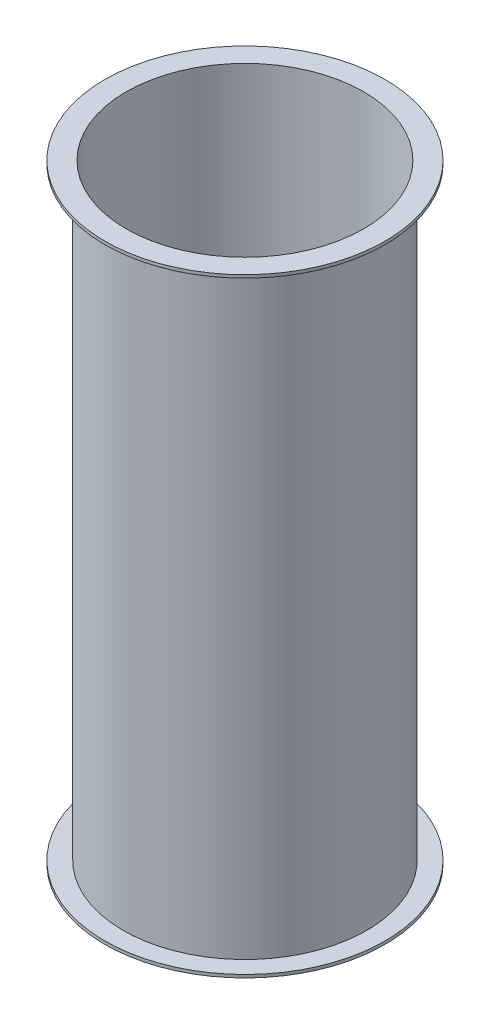
ISO-10303-21;
HEADER;
FILE_DESCRIPTION(('STEP AP214'),'2;1');
FILE_NAME('part.step','',(''),(''),'','','');
FILE_SCHEMA(('AUTOMOTIVE_DESIGN { 1 0 10303 214 1 1 1 1 }'));
ENDSEC;
DATA;
#1=APPLICATION_CONTEXT('core data for automotive mechanical design processes');
#2=APPLICATION_PROTOCOL_DEFINITION('international standard','automotive_design',2000,#1);
#3=PRODUCT_CONTEXT('',#1,'mechanical');
#4=PRODUCT('Part','Part','',(#3));
#5=PRODUCT_RELATED_PRODUCT_CATEGORY('part','',(#4));
#6=PRODUCT_DEFINITION_FORMATION('','',#4);
#7=PRODUCT_DEFINITION_CONTEXT('part definition',#1,'design');
#8=PRODUCT_DEFINITION('design','',#6,#7);
#9=PRODUCT_DEFINITION_SHAPE('','',#8);
#10=(LENGTH_UNIT() NAMED_UNIT(*) SI_UNIT(.MILLI.,.METRE.));
#11=(NAMED_UNIT(*) PLANE_ANGLE_UNIT() SI_UNIT($,.RADIAN.));
#12=(NAMED_UNIT(*) SI_UNIT($,.STERADIAN.) SOLID_ANGLE_UNIT());
#13=UNCERTAINTY_MEASURE_WITH_UNIT(LENGTH_MEASURE(1.E-05),#10,'distance_accuracy_value','');
#14=(GEOMETRIC_REPRESENTATION_CONTEXT(3) GLOBAL_UNCERTAINTY_ASSIGNED_CONTEXT((#13)) GLOBAL_UNIT_ASSIGNED_CONTEXT((#10,
#11,#12)) REPRESENTATION_CONTEXT('',''));
#15=CARTESIAN_POINT('',(0.,0.,0.));
#16=DIRECTION('',(0.,0.,1.));
#17=DIRECTION('',(1.,0.,0.));
#18=AXIS2_PLACEMENT_3D('',#15,#16,#17);
#19=CARTESIAN_POINT('',(-42.5,200.,0.));
#20=DIRECTION('',(0.,1.,0.));
#21=DIRECTION('',(1.,0.,0.));
#22=AXIS2_PLACEMENT_3D('',#19,#20,#21);
#23=PLANE('',#22);
#24=CARTESIAN_POINT('',(0.,200.,0.));
#25=DIRECTION('',(0.,1.,0.));
#26=DIRECTION('',(-1.,0.,0.));
#27=AXIS2_PLACEMENT_3D('',#24,#25,#26);
#28=CIRCLE('',#27,39.);
#29=CARTESIAN_POINT('',(-39.,200.,0.));
#30=VERTEX_POINT('',#29);
#31=EDGE_CURVE('E61',#30,#30,#28,.T.);
#32=ORIENTED_EDGE('',*,*,#31,.F.);
#33=EDGE_LOOP('',(#32));
#34=FACE_BOUND('',#33,.T.);
#35=CARTESIAN_POINT('',(0.,200.,0.));
#36=DIRECTION('',(0.,1.,0.));
#37=DIRECTION('',(-1.,0.,0.));
#38=AXIS2_PLACEMENT_3D('',#35,#36,#37);
#39=CIRCLE('',#38,46.);
#40=CARTESIAN_POINT('',(-46.,200.,0.));
#41=VERTEX_POINT('',#40);
#42=EDGE_CURVE('E11',#41,#41,#39,.T.);
#43=ORIENTED_EDGE('',*,*,#42,.T.);
#44=EDGE_LOOP('',(#43));
#45=FACE_BOUND('',#44,.T.);
#46=ADVANCED_FACE('F16',(#34,#45),#23,.T.);
#47=CARTESIAN_POINT('',(0.,199.5,0.));
#48=DIRECTION('',(0.,1.,0.));
#49=DIRECTION('',(-1.,0.,0.));
#50=AXIS2_PLACEMENT_3D('',#47,#48,#49);
#51=CYLINDRICAL_SURFACE('',#50,46.);
#52=CARTESIAN_POINT('',(0.,199.,0.));
#53=DIRECTION('',(0.,1.,0.));
#54=DIRECTION('',(-1.,0.,0.));
#55=AXIS2_PLACEMENT_3D('',#52,#53,#54);
#56=CIRCLE('',#55,46.);
#57=CARTESIAN_POINT('',(-46.,199.,0.));
#58=VERTEX_POINT('',#57);
#59=EDGE_CURVE('E20',#58,#58,#56,.T.);
#60=ORIENTED_EDGE('',*,*,#59,.T.);
#61=EDGE_LOOP('',(#60));
#62=FACE_BOUND('',#61,.T.);
#63=ORIENTED_EDGE('',*,*,#42,.F.);
#64=EDGE_LOOP('',(#63));
#65=FACE_BOUND('',#64,.T.);
#66=ADVANCED_FACE('F110',(#62,#65),#51,.T.);
#67=CARTESIAN_POINT('',(-43.,199.,0.));
#68=DIRECTION('',(0.,-1.,0.));
#69=DIRECTION('',(0.,0.,-1.));
#70=AXIS2_PLACEMENT_3D('',#67,#68,#69);
#71=PLANE('',#70);
#72=CARTESIAN_POINT('',(0.,199.,0.));
#73=DIRECTION('',(0.,1.,0.));
#74=DIRECTION('',(-1.,0.,0.));
#75=AXIS2_PLACEMENT_3D('',#72,#73,#74);
#76=CIRCLE('',#75,40.);
#77=CARTESIAN_POINT('',(-40.,199.,0.));
#78=VERTEX_POINT('',#77);
#79=EDGE_CURVE('E78',#78,#78,#76,.T.);
#80=ORIENTED_EDGE('',*,*,#79,.T.);
#81=EDGE_LOOP('',(#80));
#82=FACE_BOUND('',#81,.T.);
#83=ORIENTED_EDGE('',*,*,#59,.F.);
#84=EDGE_LOOP('',(#83));
#85=FACE_BOUND('',#84,.T.);
#86=ADVANCED_FACE('F115',(#82,#85),#71,.T.);
#87=CARTESIAN_POINT('',(0.,100.,0.));
#88=DIRECTION('',(0.,1.,0.));
#89=DIRECTION('',(-1.,0.,0.));
#90=AXIS2_PLACEMENT_3D('',#87,#88,#89);
#91=CYLINDRICAL_SURFACE('',#90,40.);
#92=CARTESIAN_POINT('',(0.,0.999999999999943,0.));
#93=DIRECTION('',(0.,1.,0.));
#94=DIRECTION('',(-1.,0.,0.));
#95=AXIS2_PLACEMENT_3D('',#92,#93,#94);
#96=CIRCLE('',#95,40.);
#97=CARTESIAN_POINT('',(-40.,0.999999999999941,0.));
#98=VERTEX_POINT('',#97);
#99=EDGE_CURVE('E80',#98,#98,#96,.T.);
#100=ORIENTED_EDGE('',*,*,#99,.T.);
#101=EDGE_LOOP('',(#100));
#102=FACE_BOUND('',#101,.T.);
#103=ORIENTED_EDGE('',*,*,#79,.F.);
#104=EDGE_LOOP('',(#103));
#105=FACE_BOUND('',#104,.T.);
#106=ADVANCED_FACE('F90',(#102,#105),#91,.T.);
#107=CARTESIAN_POINT('',(-43.,0.99999999999994,0.));
#108=DIRECTION('',(0.,1.,0.));
#109=DIRECTION('',(1.,0.,0.));
#110=AXIS2_PLACEMENT_3D('',#107,#108,#109);
#111=PLANE('',#110);
#112=ORIENTED_EDGE('',*,*,#99,.F.);
#113=EDGE_LOOP('',(#112));
#114=FACE_BOUND('',#113,.T.);
#115=CARTESIAN_POINT('',(0.,0.999999999999943,0.));
#116=DIRECTION('',(0.,1.,0.));
#117=DIRECTION('',(-1.,0.,0.));
#118=AXIS2_PLACEMENT_3D('',#115,#116,#117);
#119=CIRCLE('',#118,46.);
#120=CARTESIAN_POINT('',(-46.,0.99999999999994,0.));
#121=VERTEX_POINT('',#120);
#122=EDGE_CURVE('E74',#121,#121,#119,.T.);
#123=ORIENTED_EDGE('',*,*,#122,.T.);
#124=EDGE_LOOP('',(#123));
#125=FACE_BOUND('',#124,.T.);
#126=ADVANCED_FACE('F18',(#114,#125),#111,.T.);
#127=CARTESIAN_POINT('',(0.,0.499999999999972,0.));
#128=DIRECTION('',(0.,1.,0.));
#129=DIRECTION('',(-1.,0.,0.));
#130=AXIS2_PLACEMENT_3D('',#127,#128,#129);
#131=CYLINDRICAL_SURFACE('',#130,46.);
#132=CARTESIAN_POINT('',(0.,0.,0.));
#133=DIRECTION('',(0.,1.,0.));
#134=DIRECTION('',(-1.,0.,0.));
#135=AXIS2_PLACEMENT_3D('',#132,#133,#134);
#136=CIRCLE('',#135,46.);
#137=CARTESIAN_POINT('',(-46.,0.,0.));
#138=VERTEX_POINT('',#137);
#139=EDGE_CURVE('E66',#138,#138,#136,.T.);
#140=ORIENTED_EDGE('',*,*,#139,.T.);
#141=EDGE_LOOP('',(#140));
#142=FACE_BOUND('',#141,.T.);
#143=ORIENTED_EDGE('',*,*,#122,.F.);
#144=EDGE_LOOP('',(#143));
#145=FACE_BOUND('',#144,.T.);
#146=ADVANCED_FACE('F95',(#142,#145),#131,.T.);
#147=CARTESIAN_POINT('',(-42.5,0.,0.));
#148=DIRECTION('',(0.,-1.,0.));
#149=DIRECTION('',(0.,0.,-1.));
#150=AXIS2_PLACEMENT_3D('',#147,#148,#149);
#151=PLANE('',#150);
#152=CARTESIAN_POINT('',(0.,0.,0.));
#153=DIRECTION('',(0.,1.,0.));
#154=DIRECTION('',(-1.,0.,0.));
#155=AXIS2_PLACEMENT_3D('',#152,#153,#154);
#156=CIRCLE('',#155,39.);
#157=CARTESIAN_POINT('',(-39.,0.,0.));
#158=VERTEX_POINT('',#157);
#159=EDGE_CURVE('E67',#158,#158,#156,.T.);
#160=ORIENTED_EDGE('',*,*,#159,.T.);
#161=EDGE_LOOP('',(#160));
#162=FACE_BOUND('',#161,.T.);
#163=ORIENTED_EDGE('',*,*,#139,.F.);
#164=EDGE_LOOP('',(#163));
#165=FACE_BOUND('',#164,.T.);
#166=ADVANCED_FACE('F99',(#162,#165),#151,.T.);
#167=CARTESIAN_POINT('',(0.,100.,0.));
#168=DIRECTION('',(0.,1.,0.));
#169=DIRECTION('',(-1.,0.,0.));
#170=AXIS2_PLACEMENT_3D('',#167,#168,#169);
#171=CYLINDRICAL_SURFACE('',#170,39.);
#172=ORIENTED_EDGE('',*,*,#31,.T.);
#173=EDGE_LOOP('',(#172));
#174=FACE_BOUND('',#173,.T.);
#175=ORIENTED_EDGE('',*,*,#159,.F.);
#176=EDGE_LOOP('',(#175));
#177=FACE_BOUND('',#176,.T.);
#178=ADVANCED_FACE('F62',(#174,#177),#171,.F.);
#179=CLOSED_SHELL('',(#46,#66,#86,#106,#126,#146,#166,#178));
#180=MANIFOLD_SOLID_BREP('B1',#179);
#181=ADVANCED_BREP_SHAPE_REPRESENTATION('',(#18,#180),#14);
#182=SHAPE_DEFINITION_REPRESENTATION(#9,#181);
ENDSEC;
END-ISO-10303-21;
